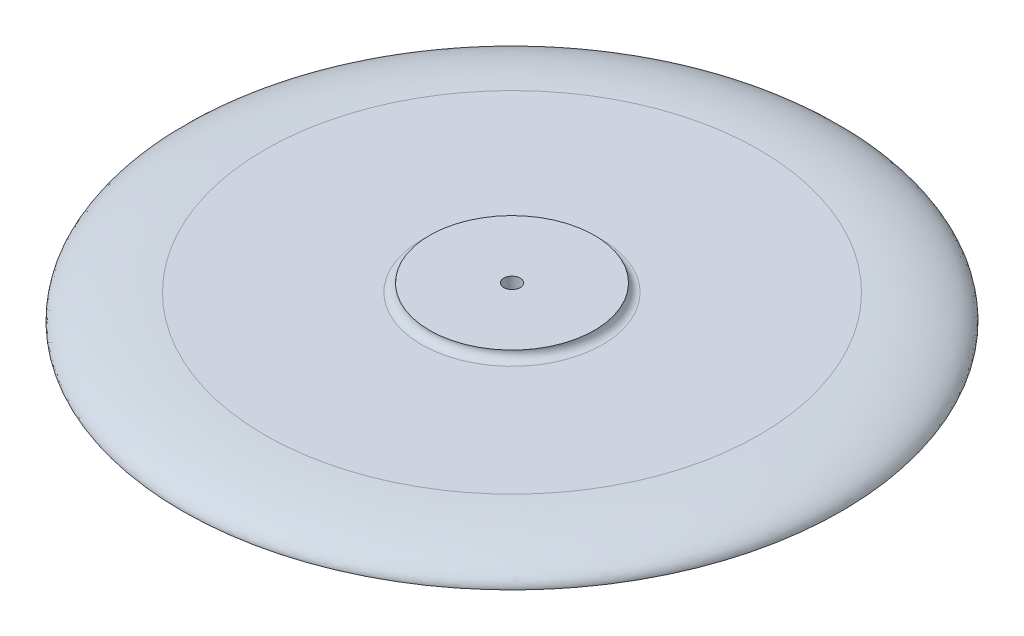
ISO-10303-21;
HEADER;
FILE_DESCRIPTION(('STEP AP214'),'2;1');
FILE_NAME('part.step','',(''),(''),'','','');
FILE_SCHEMA(('AUTOMOTIVE_DESIGN { 1 0 10303 214 1 1 1 1 }'));
ENDSEC;
DATA;
#1=APPLICATION_CONTEXT('core data for automotive mechanical design processes');
#2=APPLICATION_PROTOCOL_DEFINITION('international standard','automotive_design',2000,#1);
#3=PRODUCT_CONTEXT('',#1,'mechanical');
#4=PRODUCT('Part','Part','',(#3));
#5=PRODUCT_RELATED_PRODUCT_CATEGORY('part','',(#4));
#6=PRODUCT_DEFINITION_FORMATION('','',#4);
#7=PRODUCT_DEFINITION_CONTEXT('part definition',#1,'design');
#8=PRODUCT_DEFINITION('design','',#6,#7);
#9=PRODUCT_DEFINITION_SHAPE('','',#8);
#10=(LENGTH_UNIT() NAMED_UNIT(*) SI_UNIT(.MILLI.,.METRE.));
#11=(NAMED_UNIT(*) PLANE_ANGLE_UNIT() SI_UNIT($,.RADIAN.));
#12=(NAMED_UNIT(*) SI_UNIT($,.STERADIAN.) SOLID_ANGLE_UNIT());
#13=UNCERTAINTY_MEASURE_WITH_UNIT(LENGTH_MEASURE(1.E-05),#10,'distance_accuracy_value','');
#14=(GEOMETRIC_REPRESENTATION_CONTEXT(3) GLOBAL_UNCERTAINTY_ASSIGNED_CONTEXT((#13)) GLOBAL_UNIT_ASSIGNED_CONTEXT((#10,
#11,#12)) REPRESENTATION_CONTEXT('',''));
#15=CARTESIAN_POINT('',(0.,0.,0.));
#16=DIRECTION('',(0.,0.,1.));
#17=DIRECTION('',(1.,0.,0.));
#18=AXIS2_PLACEMENT_3D('',#15,#16,#17);
#19=CARTESIAN_POINT('',(0.,3.,0.));
#20=DIRECTION('',(0.,1.,0.));
#21=DIRECTION('',(0.,0.,1.));
#22=AXIS2_PLACEMENT_3D('',#19,#20,#21);
#23=PLANE('',#22);
#24=CARTESIAN_POINT('',(0.,3.,30.));
#25=CARTESIAN_POINT('',(-1.96349540814366,3.,30.));
#26=CARTESIAN_POINT('',(-3.92694226605106,3.,29.8066173635481));
#27=CARTESIAN_POINT('',(-7.77847705491672,3.,29.0404994606457));
#28=CARTESIAN_POINT('',(-9.66646975120171,3.,28.4677831375555));
#29=CARTESIAN_POINT('',(-13.2945361907038,3.,26.9649888131217));
#30=CARTESIAN_POINT('',(-15.0345202248315,3.,26.0349479705086));
#31=CARTESIAN_POINT('',(-18.2996937563447,3.,23.8532287676441));
#32=CARTESIAN_POINT('',(-19.8248025176819,3.,22.6016043535143));
#33=CARTESIAN_POINT('',(-22.601604353511,3.,19.8248025176784));
#34=CARTESIAN_POINT('',(-23.8532287676475,3.,18.2996937563446));
#35=CARTESIAN_POINT('',(-26.0349479705052,3.,15.0345202248315));
#36=CARTESIAN_POINT('',(-26.9649888131218,3.,13.294536190702));
#37=CARTESIAN_POINT('',(-28.4677831375555,3.,9.66646975120333));
#38=CARTESIAN_POINT('',(-29.0404994606458,3.,7.7784770549175));
#39=CARTESIAN_POINT('',(-29.8066173635481,3.,3.92694226605014));
#40=CARTESIAN_POINT('',(-30.,3.,1.96349540813006));
#41=CARTESIAN_POINT('',(-30.,3.,-1.96349540812997));
#42=CARTESIAN_POINT('',(-29.8066173635447,3.,-3.92694226604935));
#43=CARTESIAN_POINT('',(-29.0404994606491,3.,-7.77847705491842));
#44=CARTESIAN_POINT('',(-28.4677831375555,3.,-9.66646975120171));
#45=CARTESIAN_POINT('',(-26.9649888131217,3.,-13.2945361907038));
#46=CARTESIAN_POINT('',(-26.0349479705052,3.,-15.0345202248349));
#47=CARTESIAN_POINT('',(-23.8532287676475,3.,-18.2996937563413));
#48=CARTESIAN_POINT('',(-22.6016043535144,3.,-19.8248025176819));
#49=CARTESIAN_POINT('',(-19.8248025176785,3.,-22.6016043535109));
#50=CARTESIAN_POINT('',(-18.2996937563446,3.,-23.8532287676475));
#51=CARTESIAN_POINT('',(-15.0345202248315,3.,-26.0349479705052));
#52=CARTESIAN_POINT('',(-13.294536190702,3.,-26.9649888131218));
#53=CARTESIAN_POINT('',(-9.66646975120333,3.,-28.4677831375555));
#54=CARTESIAN_POINT('',(-7.7784770549175,3.,-29.0404994606458));
#55=CARTESIAN_POINT('',(-3.92694226605014,3.,-29.8066173635481));
#56=CARTESIAN_POINT('',(-1.96349540813001,3.,-30.));
#57=CARTESIAN_POINT('',(1.96349540813002,3.,-30.));
#58=CARTESIAN_POINT('',(3.92694226605104,3.,-29.8066173635481));
#59=CARTESIAN_POINT('',(7.77847705491669,3.,-29.0404994606457));
#60=CARTESIAN_POINT('',(9.66646975120171,3.,-28.4677831375589));
#61=CARTESIAN_POINT('',(13.2945361907038,3.,-26.9649888131183));
#62=CARTESIAN_POINT('',(15.0345202248315,3.,-26.0349479705052));
#63=CARTESIAN_POINT('',(18.2996937563447,3.,-23.8532287676475));
#64=CARTESIAN_POINT('',(19.8248025176819,3.,-22.6016043535144));
#65=CARTESIAN_POINT('',(22.6016043535109,3.,-19.8248025176785));
#66=CARTESIAN_POINT('',(23.8532287676475,3.,-18.2996937563412));
#67=CARTESIAN_POINT('',(26.0349479705052,3.,-15.0345202248349));
#68=CARTESIAN_POINT('',(26.9649888131201,3.,-13.2945361907022));
#69=CARTESIAN_POINT('',(28.4677831375571,3.,-9.66646975120322));
#70=CARTESIAN_POINT('',(29.0404994606466,3.,-7.77847705491671));
#71=CARTESIAN_POINT('',(29.8066173635472,3.,-3.92694226605094));
#72=CARTESIAN_POINT('',(30.,3.,-1.96349540813001));
#73=CARTESIAN_POINT('',(30.,3.,1.96349540813001));
#74=CARTESIAN_POINT('',(29.8066173635472,3.,3.92694226605014));
#75=CARTESIAN_POINT('',(29.0404994606466,3.,7.7784770549176));
#76=CARTESIAN_POINT('',(28.4677831375537,3.,9.66646975120149));
#77=CARTESIAN_POINT('',(26.9649888131235,3.,13.2945361907039));
#78=CARTESIAN_POINT('',(26.0349479705057,3.,15.0345202248342));
#79=CARTESIAN_POINT('',(23.853228767647,3.,18.2996937563419));
#80=CARTESIAN_POINT('',(22.6016043535168,3.,19.8248025176761));
#81=CARTESIAN_POINT('',(19.824802517676,3.,22.6016043535168));
#82=CARTESIAN_POINT('',(18.2996937563453,3.,23.853228767647));
#83=CARTESIAN_POINT('',(15.0345202248308,3.,26.0349479705057));
#84=CARTESIAN_POINT('',(13.2945361907039,3.,26.9649888131235));
#85=CARTESIAN_POINT('',(9.6664697512015,3.,28.4677831375537));
#86=CARTESIAN_POINT('',(7.77847705491673,3.,29.0404994606466));
#87=CARTESIAN_POINT('',(3.92694226605097,3.,29.8066173635472));
#88=CARTESIAN_POINT('',(1.96349540814366,3.,30.));
#89=CARTESIAN_POINT('',(0.,3.,30.));
#90=(BOUNDED_CURVE() B_SPLINE_CURVE(3,(#24,#25,#26,#27,#28,#29,#30,#31,#32,#33,#34,#35,#36,#37,
#38,#39,#40,#41,#42,#43,#44,#45,#46,#47,#48,#49,#50,#51,#52,#53,#54,#55,#56,#57,#58,#59,#60,#61,
#62,#63,#64,#65,#66,#67,#68,#69,#70,#71,#72,#73,#74,#75,#76,#77,#78,#79,#80,#81,#82,#83,#84,#85,
#86,#87,#88,#89),.UNSPECIFIED.,.T.,.F.) B_SPLINE_CURVE_WITH_KNOTS((4,2,2,2,2,2,2,2,2,2,2,2,2,2,
2,2,2,2,2,2,2,2,2,2,2,2,2,2,2,2,2,2,4),(0.,0.196349540849362,0.392699081698725,
0.589048622548086,0.785398163397448,0.981747704246811,1.17809724509617,1.37444678594553,
1.5707963267949,1.76714586764426,1.96349540849362,2.15984494934298,2.35619449019234,
2.55254403104171,2.74889357189107,2.94524311274043,3.14159265358979,3.33794219443916,
3.53429173528852,3.73064127613788,3.92699081698724,4.1233403578366,4.31968989868597,
4.51603943953533,4.71238898038469,4.90873852123405,5.10508806208341,5.30143760293278,
5.49778714378214,5.6941366846315,5.89048622548086,6.08683576633022,6.28318530717959),
.UNSPECIFIED.) CURVE() GEOMETRIC_REPRESENTATION_ITEM() RATIONAL_B_SPLINE_CURVE((1.,1.,1.,1.,1.,
1.,1.,1.,1.,1.,1.,1.,1.,1.,1.,1.,1.,1.,1.,1.,1.,1.,1.,1.,1.,1.,1.,1.,1.,1.,1.,1.,1.,1.,1.,1.,1.,
1.,1.,1.,1.,1.,1.,1.,1.,1.,1.,1.,1.,1.,1.,1.,1.,1.,1.,1.,1.,1.,1.,1.,1.,1.,1.,1.,1.,1.)) REPRESENTATION_ITEM(''));
#91=CARTESIAN_POINT('',(0.,3.,30.));
#92=VERTEX_POINT('',#91);
#93=EDGE_CURVE('E11',#92,#92,#90,.F.);
#94=ORIENTED_EDGE('',*,*,#93,.T.);
#95=EDGE_LOOP('',(#94));
#96=FACE_BOUND('',#95,.T.);
#97=CARTESIAN_POINT('',(0.,3.,0.));
#98=DIRECTION('',(0.,1.,0.));
#99=DIRECTION('',(0.,0.,1.));
#100=AXIS2_PLACEMENT_3D('',#97,#98,#99);
#101=CIRCLE('',#100,11.);
#102=CARTESIAN_POINT('',(0.,3.,11.));
#103=VERTEX_POINT('',#102);
#104=EDGE_CURVE('E52',#103,#103,#101,.F.);
#105=ORIENTED_EDGE('',*,*,#104,.T.);
#106=EDGE_LOOP('',(#105));
#107=FACE_BOUND('',#106,.T.);
#108=ADVANCED_FACE('F38',(#96,#107),#23,.T.);
#109=CARTESIAN_POINT('',(0.,0.,0.));
#110=DIRECTION('',(0.,1.,0.));
#111=DIRECTION('',(0.,0.,1.));
#112=AXIS2_PLACEMENT_3D('',#109,#110,#111);
#113=PLANE('',#112);
#114=CARTESIAN_POINT('',(0.,0.,0.));
#115=DIRECTION('',(0.,1.,0.));
#116=DIRECTION('',(0.,0.,1.));
#117=AXIS2_PLACEMENT_3D('',#114,#115,#116);
#118=CIRCLE('',#117,1.);
#119=CARTESIAN_POINT('',(0.,0.,1.));
#120=VERTEX_POINT('',#119);
#121=EDGE_CURVE('E99',#120,#120,#118,.T.);
#122=ORIENTED_EDGE('',*,*,#121,.T.);
#123=EDGE_LOOP('',(#122));
#124=FACE_BOUND('',#123,.T.);
#125=CARTESIAN_POINT('',(0.,0.,40.));
#126=CARTESIAN_POINT('',(2.61799387752487,0.,40.));
#127=CARTESIAN_POINT('',(5.23592302140073,0.,39.7421564847283));
#128=CARTESIAN_POINT('',(10.3713027398895,0.,38.7206659475302));
#129=CARTESIAN_POINT('',(12.888626334937,0.,37.9570441834058));
#130=CARTESIAN_POINT('',(17.7260482542702,0.,35.9533184174971));
#131=CARTESIAN_POINT('',(20.0460269664423,0.,34.7132639606726));
#132=CARTESIAN_POINT('',(24.3995916751259,0.,31.804305023531));
#133=CARTESIAN_POINT('',(26.4330700235658,0.,30.135472471358));
#134=CARTESIAN_POINT('',(30.135472471358,0.,26.4330700235658));
#135=CARTESIAN_POINT('',(31.8043050235347,0.,24.3995916751203));
#136=CARTESIAN_POINT('',(34.713263960669,0.,20.0460269664478));
#137=CARTESIAN_POINT('',(35.9533184174971,0.,17.7260482542701));
#138=CARTESIAN_POINT('',(37.9570441834058,0.,12.888626334937));
#139=CARTESIAN_POINT('',(38.72066594753,0.,10.3713027398904));
#140=CARTESIAN_POINT('',(39.7421564847284,0.,5.23592302139994));
#141=CARTESIAN_POINT('',(40.,0.,2.61799387750668));
#142=CARTESIAN_POINT('',(40.,0.,-2.61799387750668));
#143=CARTESIAN_POINT('',(39.7421564847284,0.,-5.23592302140022));
#144=CARTESIAN_POINT('',(38.7206659475301,0.,-10.37130273989));
#145=CARTESIAN_POINT('',(37.9570441834062,0.,-12.8886263349361));
#146=CARTESIAN_POINT('',(35.9533184174967,0.,-17.7260482542711));
#147=CARTESIAN_POINT('',(34.7132639606698,0.,-20.0460269664466));
#148=CARTESIAN_POINT('',(31.8043050235339,0.,-24.3995916751215));
#149=CARTESIAN_POINT('',(30.1354724713508,0.,-26.433070023573));
#150=CARTESIAN_POINT('',(26.433070023573,0.,-30.1354724713508));
#151=CARTESIAN_POINT('',(24.3995916751263,0.,-31.8043050235307));
#152=CARTESIAN_POINT('',(20.0460269664419,0.,-34.7132639606729));
#153=CARTESIAN_POINT('',(17.7260482542734,0.,-35.9533184174958));
#154=CARTESIAN_POINT('',(12.8886263349338,0.,-37.9570441834071));
#155=CARTESIAN_POINT('',(10.3713027398888,0.,-38.7206659475303));
#156=CARTESIAN_POINT('',(5.23592302140148,0.,-39.7421564847281));
#157=CARTESIAN_POINT('',(2.61799387750669,0.,-40.));
#158=CARTESIAN_POINT('',(-2.61799387750668,0.,-40.));
#159=CARTESIAN_POINT('',(-5.2359230213993,0.,-39.7421564847285));
#160=CARTESIAN_POINT('',(-10.3713027398909,0.,-38.7206659475299));
#161=CARTESIAN_POINT('',(-12.8886263349381,0.,-37.9570441834054));
#162=CARTESIAN_POINT('',(-17.726048254269,0.,-35.9533184174976));
#163=CARTESIAN_POINT('',(-20.0460269664419,0.,-34.713263960673));
#164=CARTESIAN_POINT('',(-24.3995916751262,0.,-31.8043050235307));
#165=CARTESIAN_POINT('',(-26.433070023573,0.,-30.1354724713508));
#166=CARTESIAN_POINT('',(-30.1354724713508,0.,-26.433070023573));
#167=CARTESIAN_POINT('',(-31.8043050235343,0.,-24.3995916751208));
#168=CARTESIAN_POINT('',(-34.7132639606692,0.,-20.0460269664474));
#169=CARTESIAN_POINT('',(-35.9533184174964,0.,-17.726048254272));
#170=CARTESIAN_POINT('',(-37.9570441834065,0.,-12.8886263349353));
#171=CARTESIAN_POINT('',(-38.72066594753,0.,-10.3713027398905));
#172=CARTESIAN_POINT('',(-39.7421564847284,0.,-5.23592302139986));
#173=CARTESIAN_POINT('',(-40.,0.,-2.61799387750662));
#174=CARTESIAN_POINT('',(-40.,0.,2.61799387750675));
#175=CARTESIAN_POINT('',(-39.7421564847285,0.,5.23592302139929));
#176=CARTESIAN_POINT('',(-38.7206659475299,0.,10.3713027398909));
#177=CARTESIAN_POINT('',(-37.957044183406,0.,12.8886263349366));
#178=CARTESIAN_POINT('',(-35.953318417497,0.,17.7260482542704));
#179=CARTESIAN_POINT('',(-34.7132639606729,0.,20.0460269664419));
#180=CARTESIAN_POINT('',(-31.8043050235307,0.,24.3995916751263));
#181=CARTESIAN_POINT('',(-30.1354724713509,0.,26.4330700235729));
#182=CARTESIAN_POINT('',(-26.4330700235731,0.,30.1354724713507));
#183=CARTESIAN_POINT('',(-24.3995916751263,0.,31.8043050235307));
#184=CARTESIAN_POINT('',(-20.0460269664419,0.,34.7132639606729));
#185=CARTESIAN_POINT('',(-17.726048254272,0.,35.9533184174964));
#186=CARTESIAN_POINT('',(-12.8886263349353,0.,37.9570441834065));
#187=CARTESIAN_POINT('',(-10.3713027398893,0.,38.7206659475302));
#188=CARTESIAN_POINT('',(-5.23592302140102,0.,39.7421564847282));
#189=CARTESIAN_POINT('',(-2.61799387752488,0.,40.));
#190=CARTESIAN_POINT('',(0.,0.,40.));
#191=(BOUNDED_CURVE() B_SPLINE_CURVE(3,(#125,#126,#127,#128,#129,#130,#131,#132,#133,#134,#135,
#136,#137,#138,#139,#140,#141,#142,#143,#144,#145,#146,#147,#148,#149,#150,#151,#152,#153,#154,
#155,#156,#157,#158,#159,#160,#161,#162,#163,#164,#165,#166,#167,#168,#169,#170,#171,#172,#173,
#174,#175,#176,#177,#178,#179,#180,#181,#182,#183,#184,#185,#186,#187,#188,#189,#190),
.UNSPECIFIED.,.T.,.F.) B_SPLINE_CURVE_WITH_KNOTS((4,2,2,2,2,2,2,2,2,2,2,2,2,2,2,2,2,2,2,2,2,2,2,
2,2,2,2,2,2,2,2,2,4),(0.,0.196349540849362,0.392699081698724,0.589048622548086,
0.785398163397448,0.98174770424681,1.17809724509617,1.37444678594553,1.5707963267949,
1.76714586764426,1.96349540849362,2.15984494934298,2.35619449019234,2.55254403104171,
2.74889357189107,2.94524311274043,3.14159265358979,3.33794219443916,3.53429173528852,
3.73064127613788,3.92699081698724,4.1233403578366,4.31968989868597,4.51603943953533,
4.71238898038469,4.90873852123405,5.10508806208341,5.30143760293278,5.49778714378214,
5.6941366846315,5.89048622548086,6.08683576633022,6.28318530717959),
.UNSPECIFIED.) CURVE() GEOMETRIC_REPRESENTATION_ITEM() RATIONAL_B_SPLINE_CURVE((1.,1.,1.,1.,1.,
1.,1.,1.,1.,1.,1.,1.,1.,1.,1.,1.,1.,1.,1.,1.,1.,1.,1.,1.,1.,1.,1.,1.,1.,1.,1.,1.,1.,1.,1.,1.,1.,
1.,1.,1.,1.,1.,1.,1.,1.,1.,1.,1.,1.,1.,1.,1.,1.,1.,1.,1.,1.,1.,1.,1.,1.,1.,1.,1.,1.,1.)) REPRESENTATION_ITEM(''));
#192=CARTESIAN_POINT('',(0.,0.,40.));
#193=VERTEX_POINT('',#192);
#194=EDGE_CURVE('E57',#193,#193,#191,.T.);
#195=ORIENTED_EDGE('',*,*,#194,.F.);
#196=EDGE_LOOP('',(#195));
#197=FACE_BOUND('',#196,.T.);
#198=ADVANCED_FACE('F79',(#124,#197),#113,.F.);
#199=CARTESIAN_POINT('',(0.,4.,0.));
#200=DIRECTION('',(0.,1.,0.));
#201=DIRECTION('',(0.,0.,1.));
#202=AXIS2_PLACEMENT_3D('',#199,#200,#201);
#203=PLANE('',#202);
#204=CARTESIAN_POINT('',(0.,4.,0.));
#205=DIRECTION('',(0.,1.,0.));
#206=DIRECTION('',(0.,0.,1.));
#207=AXIS2_PLACEMENT_3D('',#204,#205,#206);
#208=CIRCLE('',#207,1.);
#209=CARTESIAN_POINT('',(0.,4.,1.));
#210=VERTEX_POINT('',#209);
#211=EDGE_CURVE('E101',#210,#210,#208,.T.);
#212=ORIENTED_EDGE('',*,*,#211,.F.);
#213=EDGE_LOOP('',(#212));
#214=FACE_BOUND('',#213,.T.);
#215=CARTESIAN_POINT('',(0.,4.,0.));
#216=DIRECTION('',(0.,1.,0.));
#217=DIRECTION('',(0.,0.,1.));
#218=AXIS2_PLACEMENT_3D('',#215,#216,#217);
#219=CIRCLE('',#218,10.);
#220=CARTESIAN_POINT('',(0.,4.,10.));
#221=VERTEX_POINT('',#220);
#222=EDGE_CURVE('E62',#221,#221,#219,.T.);
#223=ORIENTED_EDGE('',*,*,#222,.T.);
#224=EDGE_LOOP('',(#223));
#225=FACE_BOUND('',#224,.T.);
#226=ADVANCED_FACE('F80',(#214,#225),#203,.T.);
#227=CARTESIAN_POINT('',(0.,0.,0.));
#228=DIRECTION('',(0.,1.,0.));
#229=DIRECTION('',(0.,0.,1.));
#230=AXIS2_PLACEMENT_3D('',#227,#228,#229);
#231=CYLINDRICAL_SURFACE('',#230,1.);
#232=ORIENTED_EDGE('',*,*,#121,.F.);
#233=EDGE_LOOP('',(#232));
#234=FACE_BOUND('',#233,.T.);
#235=ORIENTED_EDGE('',*,*,#211,.T.);
#236=EDGE_LOOP('',(#235));
#237=FACE_BOUND('',#236,.T.);
#238=ADVANCED_FACE('F87',(#234,#237),#231,.F.);
#239=CARTESIAN_POINT('',(0.,4.,0.));
#240=DIRECTION('',(0.,1.,0.));
#241=DIRECTION('',(0.,0.,1.));
#242=AXIS2_PLACEMENT_3D('',#239,#240,#241);
#243=TOROIDAL_SURFACE('',#242,11.,1.);
#244=ORIENTED_EDGE('',*,*,#104,.F.);
#245=EDGE_LOOP('',(#244));
#246=FACE_BOUND('',#245,.T.);
#247=ORIENTED_EDGE('',*,*,#222,.F.);
#248=EDGE_LOOP('',(#247));
#249=FACE_BOUND('',#248,.T.);
#250=ADVANCED_FACE('F85',(#246,#249),#243,.F.);
#251=CARTESIAN_POINT('',(0.,3.,30.));
#252=CARTESIAN_POINT('',(1.96349540814366,3.,30.));
#253=CARTESIAN_POINT('',(3.92694226605097,3.,29.8066173635472));
#254=CARTESIAN_POINT('',(7.77847705491673,3.,29.0404994606466));
#255=CARTESIAN_POINT('',(9.6664697512015,3.,28.4677831375537));
#256=CARTESIAN_POINT('',(13.2945361907039,3.,26.9649888131235));
#257=CARTESIAN_POINT('',(15.0345202248308,3.,26.0349479705057));
#258=CARTESIAN_POINT('',(18.2996937563453,3.,23.853228767647));
#259=CARTESIAN_POINT('',(19.824802517676,3.,22.6016043535168));
#260=CARTESIAN_POINT('',(22.6016043535168,3.,19.8248025176761));
#261=CARTESIAN_POINT('',(23.853228767647,3.,18.2996937563419));
#262=CARTESIAN_POINT('',(26.0349479705057,3.,15.0345202248342));
#263=CARTESIAN_POINT('',(26.9649888131235,3.,13.2945361907039));
#264=CARTESIAN_POINT('',(28.4677831375537,3.,9.66646975120149));
#265=CARTESIAN_POINT('',(29.0404994606466,3.,7.7784770549176));
#266=CARTESIAN_POINT('',(29.8066173635472,3.,3.92694226605014));
#267=CARTESIAN_POINT('',(30.,3.,1.96349540813001));
#268=CARTESIAN_POINT('',(30.,3.,-1.96349540813001));
#269=CARTESIAN_POINT('',(29.8066173635472,3.,-3.92694226605094));
#270=CARTESIAN_POINT('',(29.0404994606466,3.,-7.77847705491671));
#271=CARTESIAN_POINT('',(28.4677831375571,3.,-9.66646975120322));
#272=CARTESIAN_POINT('',(26.9649888131201,3.,-13.2945361907022));
#273=CARTESIAN_POINT('',(26.0349479705052,3.,-15.0345202248349));
#274=CARTESIAN_POINT('',(23.8532287676475,3.,-18.2996937563412));
#275=CARTESIAN_POINT('',(22.6016043535109,3.,-19.8248025176785));
#276=CARTESIAN_POINT('',(19.8248025176819,3.,-22.6016043535144));
#277=CARTESIAN_POINT('',(18.2996937563447,3.,-23.8532287676475));
#278=CARTESIAN_POINT('',(15.0345202248315,3.,-26.0349479705052));
#279=CARTESIAN_POINT('',(13.2945361907038,3.,-26.9649888131183));
#280=CARTESIAN_POINT('',(9.66646975120171,3.,-28.4677831375589));
#281=CARTESIAN_POINT('',(7.77847705491669,3.,-29.0404994606457));
#282=CARTESIAN_POINT('',(3.92694226605104,3.,-29.8066173635481));
#283=CARTESIAN_POINT('',(1.96349540813002,3.,-30.));
#284=CARTESIAN_POINT('',(-1.96349540813001,3.,-30.));
#285=CARTESIAN_POINT('',(-3.92694226605014,3.,-29.8066173635481));
#286=CARTESIAN_POINT('',(-7.7784770549175,3.,-29.0404994606458));
#287=CARTESIAN_POINT('',(-9.66646975120333,3.,-28.4677831375555));
#288=CARTESIAN_POINT('',(-13.294536190702,3.,-26.9649888131218));
#289=CARTESIAN_POINT('',(-15.0345202248315,3.,-26.0349479705052));
#290=CARTESIAN_POINT('',(-18.2996937563446,3.,-23.8532287676475));
#291=CARTESIAN_POINT('',(-19.8248025176785,3.,-22.6016043535109));
#292=CARTESIAN_POINT('',(-22.6016043535144,3.,-19.8248025176819));
#293=CARTESIAN_POINT('',(-23.8532287676475,3.,-18.2996937563413));
#294=CARTESIAN_POINT('',(-26.0349479705052,3.,-15.0345202248349));
#295=CARTESIAN_POINT('',(-26.9649888131217,3.,-13.2945361907038));
#296=CARTESIAN_POINT('',(-28.4677831375555,3.,-9.66646975120171));
#297=CARTESIAN_POINT('',(-29.0404994606491,3.,-7.77847705491842));
#298=CARTESIAN_POINT('',(-29.8066173635447,3.,-3.92694226604935));
#299=CARTESIAN_POINT('',(-30.,3.,-1.96349540812997));
#300=CARTESIAN_POINT('',(-30.,3.,1.96349540813006));
#301=CARTESIAN_POINT('',(-29.8066173635481,3.,3.92694226605014));
#302=CARTESIAN_POINT('',(-29.0404994606458,3.,7.7784770549175));
#303=CARTESIAN_POINT('',(-28.4677831375555,3.,9.66646975120333));
#304=CARTESIAN_POINT('',(-26.9649888131218,3.,13.294536190702));
#305=CARTESIAN_POINT('',(-26.0349479705052,3.,15.0345202248315));
#306=CARTESIAN_POINT('',(-23.8532287676475,3.,18.2996937563446));
#307=CARTESIAN_POINT('',(-22.601604353511,3.,19.8248025176784));
#308=CARTESIAN_POINT('',(-19.8248025176819,3.,22.6016043535143));
#309=CARTESIAN_POINT('',(-18.2996937563447,3.,23.8532287676441));
#310=CARTESIAN_POINT('',(-15.0345202248315,3.,26.0349479705086));
#311=CARTESIAN_POINT('',(-13.2945361907038,3.,26.9649888131217));
#312=CARTESIAN_POINT('',(-9.66646975120171,3.,28.4677831375555));
#313=CARTESIAN_POINT('',(-7.77847705491672,3.,29.0404994606457));
#314=CARTESIAN_POINT('',(-3.92694226605106,3.,29.8066173635481));
#315=CARTESIAN_POINT('',(-1.96349540814366,3.,30.));
#316=CARTESIAN_POINT('',(0.,3.,30.));
#317=CARTESIAN_POINT('',(0.,3.,40.));
#318=CARTESIAN_POINT('',(2.61799387752487,3.,40.));
#319=CARTESIAN_POINT('',(5.235923021401,2.99999999999915,39.7421564847296));
#320=CARTESIAN_POINT('',(10.3713027398893,3.00000000000085,38.7206659475288));
#321=CARTESIAN_POINT('',(12.8886263349348,3.,37.9570441834003));
#322=CARTESIAN_POINT('',(17.7260482542724,3.,35.9533184175026));
#323=CARTESIAN_POINT('',(20.0460269664434,3.,34.7132639606742));
#324=CARTESIAN_POINT('',(24.3995916751248,3.,31.8043050235294));
#325=CARTESIAN_POINT('',(26.4330700235692,2.99999999999957,30.1354724713546));
#326=CARTESIAN_POINT('',(30.1354724713546,3.00000000000042,26.4330700235692));
#327=CARTESIAN_POINT('',(31.8043050235362,2.99999999999106,24.399591675118));
#328=CARTESIAN_POINT('',(34.7132639606674,3.00000000000894,20.0460269664502));
#329=CARTESIAN_POINT('',(35.9533184175026,3.00000000000852,17.7260482542741));
#330=CARTESIAN_POINT('',(37.9570441834003,2.99999999999148,12.8886263349331));
#331=CARTESIAN_POINT('',(38.7206659475288,3.00000000000044,10.3713027398893));
#332=CARTESIAN_POINT('',(39.7421564847296,2.99999999999959,5.23592302140103));
#333=CARTESIAN_POINT('',(40.,3.,2.61799387750668));
#334=CARTESIAN_POINT('',(40.,3.,-2.61799387750668));
#335=CARTESIAN_POINT('',(39.7421564847364,2.99999999999957,-5.23592302140268));
#336=CARTESIAN_POINT('',(38.720665947522,3.00000000000043,-10.3713027398875));
#337=CARTESIAN_POINT('',(37.9570441834072,2.9999999999851,-12.8886263349382));
#338=CARTESIAN_POINT('',(35.9533184174958,3.0000000000149,-17.726048254269));
#339=CARTESIAN_POINT('',(34.7132639606714,3.,-20.0460269664476));
#340=CARTESIAN_POINT('',(31.8043050235323,3.,-24.3995916751205));
#341=CARTESIAN_POINT('',(30.1354724713491,3.00000000000809,-26.4330700235679));
#342=CARTESIAN_POINT('',(26.4330700235747,2.99999999999191,-30.1354724713559));
#343=CARTESIAN_POINT('',(24.3995916751273,3.,-31.8043050235322));
#344=CARTESIAN_POINT('',(20.0460269664409,3.,-34.7132639606713));
#345=CARTESIAN_POINT('',(17.7260482542717,2.99999999998936,-35.9533184174956));
#346=CARTESIAN_POINT('',(12.8886263349356,3.00000000001064,-37.9570441834073));
#347=CARTESIAN_POINT('',(10.3713027398909,3.00000000001066,-38.7206659475322));
#348=CARTESIAN_POINT('',(5.2359230213994,2.99999999998937,-39.7421564847262));
#349=CARTESIAN_POINT('',(2.61799387750669,3.,-40.));
#350=CARTESIAN_POINT('',(-2.61799387750668,3.,-40.));
#351=CARTESIAN_POINT('',(-5.23592302139849,2.99999999998936,-39.742156484733));
#352=CARTESIAN_POINT('',(-10.3713027398917,3.00000000001064,-38.7206659475254));
#353=CARTESIAN_POINT('',(-12.8886263349389,2.99999999999999,-37.9570441834073));
#354=CARTESIAN_POINT('',(-17.7260482542682,2.99999999999999,-35.9533184174957));
#355=CARTESIAN_POINT('',(-20.0460269664408,3.,-34.7132639606714));
#356=CARTESIAN_POINT('',(-24.3995916751273,3.,-31.8043050235323));
#357=CARTESIAN_POINT('',(-26.4330700235679,3.0000000000081,-30.1354724713491));
#358=CARTESIAN_POINT('',(-30.1354724713559,2.99999999999192,-26.4330700235747));
#359=CARTESIAN_POINT('',(-31.804305023539,3.,-24.3995916751239));
#360=CARTESIAN_POINT('',(-34.7132639606645,3.,-20.0460269664443));
#361=CARTESIAN_POINT('',(-35.9533184174956,3.,-17.7260482542717));
#362=CARTESIAN_POINT('',(-37.9570441834073,3.,-12.8886263349356));
#363=CARTESIAN_POINT('',(-38.7206659475322,2.99999999999957,-10.3713027398918));
#364=CARTESIAN_POINT('',(-39.7421564847262,3.00000000000042,-5.23592302139857));
#365=CARTESIAN_POINT('',(-40.,3.,-2.61799387750662));
#366=CARTESIAN_POINT('',(-40.,3.,2.61799387750675));
#367=CARTESIAN_POINT('',(-39.742156484733,2.99999999998936,5.23592302139849));
#368=CARTESIAN_POINT('',(-38.7206659475254,3.00000000001064,10.3713027398917));
#369=CARTESIAN_POINT('',(-37.9570441834073,2.99999999999999,12.8886263349372));
#370=CARTESIAN_POINT('',(-35.9533184174957,2.99999999999999,17.7260482542699));
#371=CARTESIAN_POINT('',(-34.7132639606714,3.00000000000938,20.0460269664443));
#372=CARTESIAN_POINT('',(-31.8043050235323,2.99999999999064,24.3995916751239));
#373=CARTESIAN_POINT('',(-30.1354724713492,3.00000000000042,26.4330700235712));
#374=CARTESIAN_POINT('',(-26.4330700235748,2.99999999999957,30.1354724713524));
#375=CARTESIAN_POINT('',(-24.3995916751274,3.,31.8043050235322));
#376=CARTESIAN_POINT('',(-20.0460269664409,3.,34.7132639606713));
#377=CARTESIAN_POINT('',(-17.7260482542717,3.,35.9533184174956));
#378=CARTESIAN_POINT('',(-12.8886263349356,3.,37.9570441834073));
#379=CARTESIAN_POINT('',(-10.3713027398884,2.99999999998808,38.7206659475254));
#380=CARTESIAN_POINT('',(-5.23592302140198,3.00000000001192,39.742156484733));
#381=CARTESIAN_POINT('',(-2.61799387752488,3.,40.));
#382=CARTESIAN_POINT('',(0.,3.,40.));
#383=CARTESIAN_POINT('',(0.,0.,40.));
#384=CARTESIAN_POINT('',(2.61799387752487,0.,40.));
#385=CARTESIAN_POINT('',(5.23592302140073,0.,39.7421564847283));
#386=CARTESIAN_POINT('',(10.3713027398895,0.,38.7206659475302));
#387=CARTESIAN_POINT('',(12.888626334937,0.,37.9570441834058));
#388=CARTESIAN_POINT('',(17.7260482542702,0.,35.9533184174971));
#389=CARTESIAN_POINT('',(20.0460269664423,0.,34.7132639606726));
#390=CARTESIAN_POINT('',(24.3995916751259,0.,31.804305023531));
#391=CARTESIAN_POINT('',(26.4330700235658,0.,30.135472471358));
#392=CARTESIAN_POINT('',(30.135472471358,0.,26.4330700235658));
#393=CARTESIAN_POINT('',(31.8043050235347,0.,24.3995916751203));
#394=CARTESIAN_POINT('',(34.713263960669,0.,20.0460269664478));
#395=CARTESIAN_POINT('',(35.9533184174971,0.,17.7260482542701));
#396=CARTESIAN_POINT('',(37.9570441834058,0.,12.888626334937));
#397=CARTESIAN_POINT('',(38.72066594753,0.,10.3713027398904));
#398=CARTESIAN_POINT('',(39.7421564847284,0.,5.23592302139994));
#399=CARTESIAN_POINT('',(40.,0.,2.61799387750668));
#400=CARTESIAN_POINT('',(40.,0.,-2.61799387750668));
#401=CARTESIAN_POINT('',(39.7421564847284,0.,-5.23592302140022));
#402=CARTESIAN_POINT('',(38.7206659475301,0.,-10.37130273989));
#403=CARTESIAN_POINT('',(37.9570441834062,0.,-12.8886263349361));
#404=CARTESIAN_POINT('',(35.9533184174967,0.,-17.7260482542711));
#405=CARTESIAN_POINT('',(34.7132639606698,0.,-20.0460269664466));
#406=CARTESIAN_POINT('',(31.8043050235339,0.,-24.3995916751215));
#407=CARTESIAN_POINT('',(30.1354724713508,0.,-26.433070023573));
#408=CARTESIAN_POINT('',(26.433070023573,0.,-30.1354724713508));
#409=CARTESIAN_POINT('',(24.3995916751263,0.,-31.8043050235307));
#410=CARTESIAN_POINT('',(20.0460269664419,0.,-34.7132639606729));
#411=CARTESIAN_POINT('',(17.7260482542734,0.,-35.9533184174958));
#412=CARTESIAN_POINT('',(12.8886263349338,0.,-37.9570441834071));
#413=CARTESIAN_POINT('',(10.3713027398888,0.,-38.7206659475303));
#414=CARTESIAN_POINT('',(5.23592302140148,0.,-39.7421564847281));
#415=CARTESIAN_POINT('',(2.61799387750669,0.,-40.));
#416=CARTESIAN_POINT('',(-2.61799387750668,0.,-40.));
#417=CARTESIAN_POINT('',(-5.2359230213993,0.,-39.7421564847285));
#418=CARTESIAN_POINT('',(-10.3713027398909,0.,-38.7206659475299));
#419=CARTESIAN_POINT('',(-12.8886263349381,0.,-37.9570441834054));
#420=CARTESIAN_POINT('',(-17.726048254269,0.,-35.9533184174976));
#421=CARTESIAN_POINT('',(-20.0460269664419,0.,-34.713263960673));
#422=CARTESIAN_POINT('',(-24.3995916751262,0.,-31.8043050235307));
#423=CARTESIAN_POINT('',(-26.433070023573,0.,-30.1354724713508));
#424=CARTESIAN_POINT('',(-30.1354724713508,0.,-26.433070023573));
#425=CARTESIAN_POINT('',(-31.8043050235343,0.,-24.3995916751208));
#426=CARTESIAN_POINT('',(-34.7132639606692,0.,-20.0460269664474));
#427=CARTESIAN_POINT('',(-35.9533184174964,0.,-17.726048254272));
#428=CARTESIAN_POINT('',(-37.9570441834065,0.,-12.8886263349353));
#429=CARTESIAN_POINT('',(-38.72066594753,0.,-10.3713027398905));
#430=CARTESIAN_POINT('',(-39.7421564847284,0.,-5.23592302139986));
#431=CARTESIAN_POINT('',(-40.,0.,-2.61799387750662));
#432=CARTESIAN_POINT('',(-40.,0.,2.61799387750675));
#433=CARTESIAN_POINT('',(-39.7421564847285,0.,5.23592302139929));
#434=CARTESIAN_POINT('',(-38.7206659475299,0.,10.3713027398909));
#435=CARTESIAN_POINT('',(-37.957044183406,0.,12.8886263349366));
#436=CARTESIAN_POINT('',(-35.953318417497,0.,17.7260482542704));
#437=CARTESIAN_POINT('',(-34.7132639606729,0.,20.0460269664419));
#438=CARTESIAN_POINT('',(-31.8043050235307,0.,24.3995916751263));
#439=CARTESIAN_POINT('',(-30.1354724713509,0.,26.4330700235729));
#440=CARTESIAN_POINT('',(-26.4330700235731,0.,30.1354724713507));
#441=CARTESIAN_POINT('',(-24.3995916751263,0.,31.8043050235307));
#442=CARTESIAN_POINT('',(-20.0460269664419,0.,34.7132639606729));
#443=CARTESIAN_POINT('',(-17.726048254272,0.,35.9533184174964));
#444=CARTESIAN_POINT('',(-12.8886263349353,0.,37.9570441834065));
#445=CARTESIAN_POINT('',(-10.3713027398893,0.,38.7206659475302));
#446=CARTESIAN_POINT('',(-5.23592302140102,0.,39.7421564847282));
#447=CARTESIAN_POINT('',(-2.61799387752488,0.,40.));
#448=CARTESIAN_POINT('',(0.,0.,40.));
#449=(BOUNDED_SURFACE() B_SPLINE_SURFACE(2,3,((#251,#252,#253,#254,#255,#256,#257,#258,#259,
#260,#261,#262,#263,#264,#265,#266,#267,#268,#269,#270,#271,#272,#273,#274,#275,#276,#277,#278,
#279,#280,#281,#282,#283,#284,#285,#286,#287,#288,#289,#290,#291,#292,#293,#294,#295,#296,#297,
#298,#299,#300,#301,#302,#303,#304,#305,#306,#307,#308,#309,#310,#311,#312,#313,#314,#315,#316),
(#317,#318,#319,#320,#321,#322,#323,#324,#325,#326,#327,#328,#329,#330,#331,#332,#333,#334,#335,
#336,#337,#338,#339,#340,#341,#342,#343,#344,#345,#346,#347,#348,#349,#350,#351,#352,#353,#354,
#355,#356,#357,#358,#359,#360,#361,#362,#363,#364,#365,#366,#367,#368,#369,#370,#371,#372,#373,
#374,#375,#376,#377,#378,#379,#380,#381,#382),(#383,#384,#385,#386,#387,#388,#389,#390,#391,
#392,#393,#394,#395,#396,#397,#398,#399,#400,#401,#402,#403,#404,#405,#406,#407,#408,#409,#410,
#411,#412,#413,#414,#415,#416,#417,#418,#419,#420,#421,#422,#423,#424,#425,#426,#427,#428,#429,
#430,#431,#432,#433,#434,#435,#436,#437,#438,#439,#440,#441,#442,#443,#444,#445,#446,#447,
#448)),.UNSPECIFIED.,.F.,.T.,.F.) B_SPLINE_SURFACE_WITH_KNOTS((3,3),(4,2,2,2,2,2,2,2,2,2,2,2,2,
2,2,2,2,2,2,2,2,2,2,2,2,2,2,2,2,2,2,2,4),(0.,1.),(0.,0.196349540849362,0.392699081698724,
0.589048622548086,0.785398163397448,0.98174770424681,1.17809724509617,1.37444678594553,
1.5707963267949,1.76714586764426,1.96349540849362,2.15984494934298,2.35619449019234,
2.55254403104171,2.74889357189107,2.94524311274043,3.14159265358979,3.33794219443916,
3.53429173528852,3.73064127613788,3.92699081698724,4.1233403578366,4.31968989868597,
4.51603943953533,4.71238898038469,4.90873852123405,5.10508806208341,5.30143760293278,
5.49778714378214,5.6941366846315,5.89048622548086,6.08683576633022,6.28318530717959),
.UNSPECIFIED.) GEOMETRIC_REPRESENTATION_ITEM() RATIONAL_B_SPLINE_SURFACE(((1.,1.,1.,1.,1.,1.,1.,
1.,1.,1.,1.,1.,1.,1.,1.,1.,1.,1.,1.,1.,1.,1.,1.,1.,1.,1.,1.,1.,1.,1.,1.,1.,1.,1.,1.,1.,1.,1.,1.,
1.,1.,1.,1.,1.,1.,1.,1.,1.,1.,1.,1.,1.,1.,1.,1.,1.,1.,1.,1.,1.,1.,1.,1.,1.,1.,1.),
(0.707106781186548,0.707106781186548,0.707106781186547,0.707106781186547,0.707106781186548,
0.707106781186548,0.707106781186548,0.707106781186548,0.707106781186548,0.707106781186548,
0.707106781186548,0.707106781186548,0.707106781186548,0.707106781186548,0.707106781186547,
0.707106781186547,0.707106781186548,0.707106781186548,0.707106781186547,0.707106781186547,
0.707106781186548,0.707106781186548,0.707106781186548,0.707106781186548,0.707106781186548,
0.707106781186548,0.707106781186548,0.707106781186548,0.707106781186548,0.707106781186548,
0.707106781186547,0.707106781186547,0.707106781186548,0.707106781186548,0.707106781186548,
0.707106781186548,0.707106781186548,0.707106781186548,0.707106781186548,0.707106781186548,
0.707106781186547,0.707106781186547,0.707106781186548,0.707106781186548,0.707106781186548,
0.707106781186548,0.707106781186548,0.707106781186548,0.707106781186548,0.707106781186548,
0.707106781186548,0.707106781186548,0.707106781186548,0.707106781186548,0.707106781186547,
0.707106781186547,0.707106781186548,0.707106781186548,0.707106781186548,0.707106781186548,
0.707106781186548,0.707106781186548,0.707106781186548,0.707106781186548,0.707106781186548,
0.707106781186548),(1.,1.,1.,1.,1.,1.,1.,1.,1.,1.,1.,1.,1.,1.,1.,1.,1.,1.,1.,1.,1.,1.,1.,1.,1.,
1.,1.,1.,1.,1.,1.,1.,1.,1.,1.,1.,1.,1.,1.,1.,1.,1.,1.,1.,1.,1.,1.,1.,1.,1.,1.,1.,1.,1.,1.,1.,1.,
1.,1.,1.,1.,1.,1.,1.,1.,1.))) REPRESENTATION_ITEM('') SURFACE());
#450=ORIENTED_EDGE('',*,*,#194,.T.);
#451=EDGE_LOOP('',(#450));
#452=FACE_BOUND('',#451,.T.);
#453=ORIENTED_EDGE('',*,*,#93,.F.);
#454=EDGE_LOOP('',(#453));
#455=FACE_BOUND('',#454,.T.);
#456=ADVANCED_FACE('F41',(#452,#455),#449,.T.);
#457=CLOSED_SHELL('',(#108,#198,#226,#238,#250,#456));
#458=MANIFOLD_SOLID_BREP('B2',#457);
#459=ADVANCED_BREP_SHAPE_REPRESENTATION('',(#18,#458),#14);
#460=SHAPE_DEFINITION_REPRESENTATION(#9,#459);
ENDSEC;
END-ISO-10303-21;
